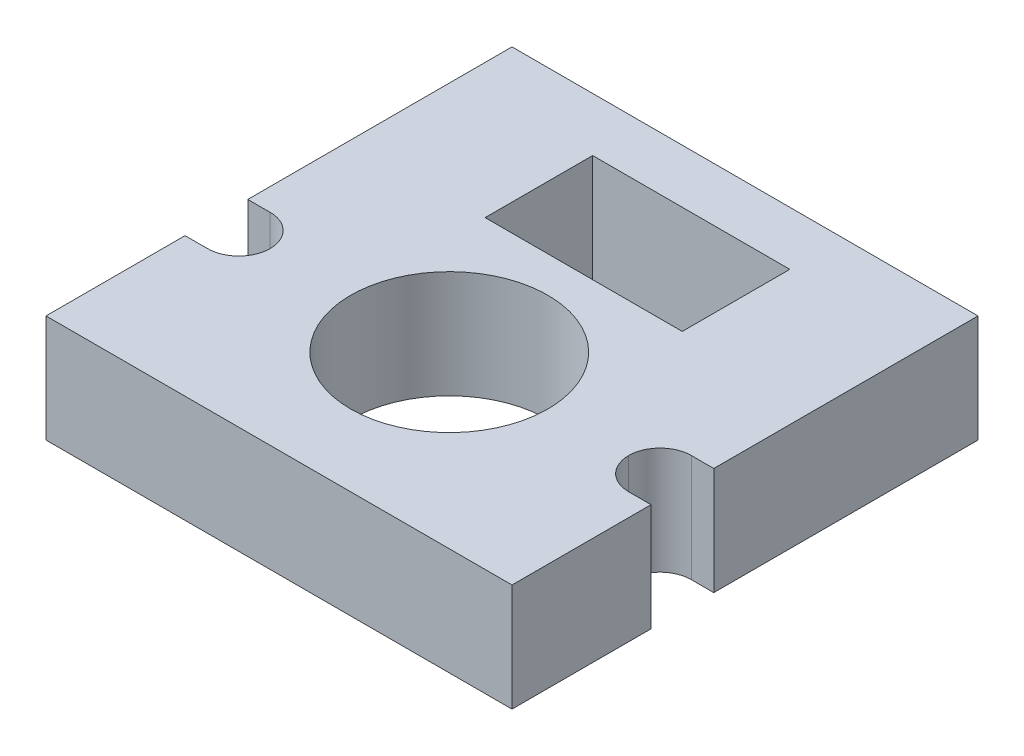
ISO-10303-21;
HEADER;
FILE_DESCRIPTION(('STEP AP214'),'2;1');
FILE_NAME('part.step','',(''),(''),'','','');
FILE_SCHEMA(('AUTOMOTIVE_DESIGN { 1 0 10303 214 1 1 1 1 }'));
ENDSEC;
DATA;
#1=APPLICATION_CONTEXT('core data for automotive mechanical design processes');
#2=APPLICATION_PROTOCOL_DEFINITION('international standard','automotive_design',2000,#1);
#3=PRODUCT_CONTEXT('',#1,'mechanical');
#4=PRODUCT('Part','Part','',(#3));
#5=PRODUCT_RELATED_PRODUCT_CATEGORY('part','',(#4));
#6=PRODUCT_DEFINITION_FORMATION('','',#4);
#7=PRODUCT_DEFINITION_CONTEXT('part definition',#1,'design');
#8=PRODUCT_DEFINITION('design','',#6,#7);
#9=PRODUCT_DEFINITION_SHAPE('','',#8);
#10=(LENGTH_UNIT() NAMED_UNIT(*) SI_UNIT(.MILLI.,.METRE.));
#11=(NAMED_UNIT(*) PLANE_ANGLE_UNIT() SI_UNIT($,.RADIAN.));
#12=(NAMED_UNIT(*) SI_UNIT($,.STERADIAN.) SOLID_ANGLE_UNIT());
#13=UNCERTAINTY_MEASURE_WITH_UNIT(LENGTH_MEASURE(1.E-05),#10,'distance_accuracy_value','');
#14=(GEOMETRIC_REPRESENTATION_CONTEXT(3) GLOBAL_UNCERTAINTY_ASSIGNED_CONTEXT((#13)) GLOBAL_UNIT_ASSIGNED_CONTEXT((#10,
#11,#12)) REPRESENTATION_CONTEXT('',''));
#15=CARTESIAN_POINT('',(0.,0.,0.));
#16=DIRECTION('',(0.,0.,1.));
#17=DIRECTION('',(1.,0.,0.));
#18=AXIS2_PLACEMENT_3D('',#15,#16,#17);
#19=CARTESIAN_POINT('',(-13.,6.,0.));
#20=DIRECTION('',(-1.,0.,0.));
#21=DIRECTION('',(0.,0.,1.));
#22=AXIS2_PLACEMENT_3D('',#19,#20,#21);
#23=PLANE('',#22);
#24=DIRECTION('',(0.,0.,-1.));
#25=VECTOR('',#24,1.);
#26=CARTESIAN_POINT('',(-13.,0.,0.));
#27=LINE('',#26,#25);
#28=CARTESIAN_POINT('',(-13.,0.,1.74228874489923));
#29=VERTEX_POINT('',#28);
#30=CARTESIAN_POINT('',(-13.,0.,-13.));
#31=VERTEX_POINT('',#30);
#32=EDGE_CURVE('E227',#29,#31,#27,.T.);
#33=ORIENTED_EDGE('',*,*,#32,.F.);
#34=DIRECTION('',(0.,-1.,0.));
#35=VECTOR('',#34,1.);
#36=CARTESIAN_POINT('',(-13.,6.,1.74228874489923));
#37=LINE('',#36,#35);
#38=CARTESIAN_POINT('',(-13.,6.,1.74228874489923));
#39=VERTEX_POINT('',#38);
#40=EDGE_CURVE('E268',#39,#29,#37,.T.);
#41=ORIENTED_EDGE('',*,*,#40,.F.);
#42=DIRECTION('',(0.,0.,-1.));
#43=VECTOR('',#42,1.);
#44=CARTESIAN_POINT('',(-13.,6.,0.));
#45=LINE('',#44,#43);
#46=CARTESIAN_POINT('',(-13.,6.,-13.));
#47=VERTEX_POINT('',#46);
#48=EDGE_CURVE('E191',#39,#47,#45,.T.);
#49=ORIENTED_EDGE('',*,*,#48,.T.);
#50=DIRECTION('',(0.,-1.,0.));
#51=VECTOR('',#50,1.);
#52=CARTESIAN_POINT('',(-13.,6.,-13.));
#53=LINE('',#52,#51);
#54=EDGE_CURVE('E171',#47,#31,#53,.T.);
#55=ORIENTED_EDGE('',*,*,#54,.T.);
#56=EDGE_LOOP('',(#33,#41,#49,#55));
#57=FACE_BOUND('',#56,.T.);
#58=ADVANCED_FACE('F34',(#57),#23,.T.);
#59=CARTESIAN_POINT('',(0.,6.,1.74228874489923));
#60=DIRECTION('',(0.,0.,-1.));
#61=DIRECTION('',(-1.,0.,0.));
#62=AXIS2_PLACEMENT_3D('',#59,#60,#61);
#63=PLANE('',#62);
#64=DIRECTION('',(1.,0.,0.));
#65=VECTOR('',#64,1.);
#66=CARTESIAN_POINT('',(0.,0.,1.74228874489923));
#67=LINE('',#66,#65);
#68=CARTESIAN_POINT('',(-11.75,0.,1.74228874489923));
#69=VERTEX_POINT('',#68);
#70=EDGE_CURVE('E230',#29,#69,#67,.T.);
#71=ORIENTED_EDGE('',*,*,#70,.T.);
#72=DIRECTION('',(0.,-1.,0.));
#73=VECTOR('',#72,1.);
#74=CARTESIAN_POINT('',(-11.75,6.,1.74228874489923));
#75=LINE('',#74,#73);
#76=CARTESIAN_POINT('',(-11.75,6.,1.74228874489923));
#77=VERTEX_POINT('',#76);
#78=EDGE_CURVE('E279',#69,#77,#75,.F.);
#79=ORIENTED_EDGE('',*,*,#78,.T.);
#80=DIRECTION('',(1.,0.,0.));
#81=VECTOR('',#80,1.);
#82=CARTESIAN_POINT('',(0.,6.,1.74228874489923));
#83=LINE('',#82,#81);
#84=EDGE_CURVE('E194',#39,#77,#83,.T.);
#85=ORIENTED_EDGE('',*,*,#84,.F.);
#86=ORIENTED_EDGE('',*,*,#40,.T.);
#87=EDGE_LOOP('',(#71,#79,#85,#86));
#88=FACE_BOUND('',#87,.T.);
#89=ADVANCED_FACE('F354',(#88),#63,.F.);
#90=CARTESIAN_POINT('',(0.,6.,5.24228874489923));
#91=DIRECTION('',(0.,0.,1.));
#92=DIRECTION('',(1.,0.,0.));
#93=AXIS2_PLACEMENT_3D('',#90,#91,#92);
#94=PLANE('',#93);
#95=DIRECTION('',(-1.,0.,0.));
#96=VECTOR('',#95,1.);
#97=CARTESIAN_POINT('',(0.,6.,5.24228874489923));
#98=LINE('',#97,#96);
#99=CARTESIAN_POINT('',(-11.75,6.,5.24228874489923));
#100=VERTEX_POINT('',#99);
#101=CARTESIAN_POINT('',(-13.,6.,5.24228874489923));
#102=VERTEX_POINT('',#101);
#103=EDGE_CURVE('E197',#100,#102,#98,.T.);
#104=ORIENTED_EDGE('',*,*,#103,.F.);
#105=DIRECTION('',(0.,-1.,0.));
#106=VECTOR('',#105,1.);
#107=CARTESIAN_POINT('',(-11.75,0.,5.24228874489923));
#108=LINE('',#107,#106);
#109=CARTESIAN_POINT('',(-11.75,0.,5.24228874489923));
#110=VERTEX_POINT('',#109);
#111=EDGE_CURVE('E282',#100,#110,#108,.T.);
#112=ORIENTED_EDGE('',*,*,#111,.T.);
#113=DIRECTION('',(-1.,0.,0.));
#114=VECTOR('',#113,1.);
#115=CARTESIAN_POINT('',(0.,0.,5.24228874489923));
#116=LINE('',#115,#114);
#117=CARTESIAN_POINT('',(-13.,0.,5.24228874489923));
#118=VERTEX_POINT('',#117);
#119=EDGE_CURVE('E234',#110,#118,#116,.T.);
#120=ORIENTED_EDGE('',*,*,#119,.T.);
#121=DIRECTION('',(0.,-1.,0.));
#122=VECTOR('',#121,1.);
#123=CARTESIAN_POINT('',(-13.,6.,5.24228874489923));
#124=LINE('',#123,#122);
#125=EDGE_CURVE('E265',#102,#118,#124,.T.);
#126=ORIENTED_EDGE('',*,*,#125,.F.);
#127=EDGE_LOOP('',(#104,#112,#120,#126));
#128=FACE_BOUND('',#127,.T.);
#129=ADVANCED_FACE('F311',(#128),#94,.F.);
#130=CARTESIAN_POINT('',(-13.,0.,13.));
#131=VERTEX_POINT('',#130);
#132=EDGE_CURVE('E231',#131,#118,#27,.T.);
#133=ORIENTED_EDGE('',*,*,#132,.F.);
#134=DIRECTION('',(0.,-1.,0.));
#135=VECTOR('',#134,1.);
#136=CARTESIAN_POINT('',(-13.,6.,13.));
#137=LINE('',#136,#135);
#138=CARTESIAN_POINT('',(-13.,6.,13.));
#139=VERTEX_POINT('',#138);
#140=EDGE_CURVE('E263',#139,#131,#137,.T.);
#141=ORIENTED_EDGE('',*,*,#140,.F.);
#142=EDGE_CURVE('E195',#139,#102,#45,.T.);
#143=ORIENTED_EDGE('',*,*,#142,.T.);
#144=ORIENTED_EDGE('',*,*,#125,.T.);
#145=EDGE_LOOP('',(#133,#141,#143,#144));
#146=FACE_BOUND('',#145,.T.);
#147=ADVANCED_FACE('F316',(#146),#23,.T.);
#148=CARTESIAN_POINT('',(0.,6.,13.));
#149=DIRECTION('',(0.,0.,1.));
#150=DIRECTION('',(1.,0.,0.));
#151=AXIS2_PLACEMENT_3D('',#148,#149,#150);
#152=PLANE('',#151);
#153=DIRECTION('',(-1.,0.,0.));
#154=VECTOR('',#153,1.);
#155=CARTESIAN_POINT('',(0.,0.,13.));
#156=LINE('',#155,#154);
#157=CARTESIAN_POINT('',(13.,0.,13.));
#158=VERTEX_POINT('',#157);
#159=EDGE_CURVE('E236',#158,#131,#156,.T.);
#160=ORIENTED_EDGE('',*,*,#159,.F.);
#161=DIRECTION('',(0.,-1.,0.));
#162=VECTOR('',#161,1.);
#163=CARTESIAN_POINT('',(13.,6.,13.));
#164=LINE('',#163,#162);
#165=CARTESIAN_POINT('',(13.,6.,13.));
#166=VERTEX_POINT('',#165);
#167=EDGE_CURVE('E261',#166,#158,#164,.T.);
#168=ORIENTED_EDGE('',*,*,#167,.F.);
#169=DIRECTION('',(-1.,0.,0.));
#170=VECTOR('',#169,1.);
#171=CARTESIAN_POINT('',(0.,6.,13.));
#172=LINE('',#171,#170);
#173=EDGE_CURVE('E199',#166,#139,#172,.T.);
#174=ORIENTED_EDGE('',*,*,#173,.T.);
#175=ORIENTED_EDGE('',*,*,#140,.T.);
#176=EDGE_LOOP('',(#160,#168,#174,#175));
#177=FACE_BOUND('',#176,.T.);
#178=ADVANCED_FACE('F320',(#177),#152,.T.);
#179=CARTESIAN_POINT('',(13.,6.,0.));
#180=DIRECTION('',(-1.,0.,0.));
#181=DIRECTION('',(0.,0.,1.));
#182=AXIS2_PLACEMENT_3D('',#179,#180,#181);
#183=PLANE('',#182);
#184=DIRECTION('',(0.,0.,-1.));
#185=VECTOR('',#184,1.);
#186=CARTESIAN_POINT('',(13.,0.,0.));
#187=LINE('',#186,#185);
#188=CARTESIAN_POINT('',(13.,0.,5.24228874489907));
#189=VERTEX_POINT('',#188);
#190=EDGE_CURVE('E239',#158,#189,#187,.T.);
#191=ORIENTED_EDGE('',*,*,#190,.T.);
#192=DIRECTION('',(0.,-1.,0.));
#193=VECTOR('',#192,1.);
#194=CARTESIAN_POINT('',(13.,6.,5.24228874489907));
#195=LINE('',#194,#193);
#196=CARTESIAN_POINT('',(13.,6.,5.24228874489907));
#197=VERTEX_POINT('',#196);
#198=EDGE_CURVE('E258',#197,#189,#195,.T.);
#199=ORIENTED_EDGE('',*,*,#198,.F.);
#200=DIRECTION('',(0.,0.,-1.));
#201=VECTOR('',#200,1.);
#202=CARTESIAN_POINT('',(13.,6.,0.));
#203=LINE('',#202,#201);
#204=EDGE_CURVE('E202',#166,#197,#203,.T.);
#205=ORIENTED_EDGE('',*,*,#204,.F.);
#206=ORIENTED_EDGE('',*,*,#167,.T.);
#207=EDGE_LOOP('',(#191,#199,#205,#206));
#208=FACE_BOUND('',#207,.T.);
#209=ADVANCED_FACE('F325',(#208),#183,.F.);
#210=CARTESIAN_POINT('',(0.,6.,5.24228874489907));
#211=DIRECTION('',(0.,0.,1.));
#212=DIRECTION('',(1.,0.,0.));
#213=AXIS2_PLACEMENT_3D('',#210,#211,#212);
#214=PLANE('',#213);
#215=DIRECTION('',(-1.,0.,0.));
#216=VECTOR('',#215,1.);
#217=CARTESIAN_POINT('',(0.,0.,5.24228874489907));
#218=LINE('',#217,#216);
#219=CARTESIAN_POINT('',(11.75,0.,5.24228874489907));
#220=VERTEX_POINT('',#219);
#221=EDGE_CURVE('E242',#189,#220,#218,.T.);
#222=ORIENTED_EDGE('',*,*,#221,.T.);
#223=DIRECTION('',(0.,-1.,0.));
#224=VECTOR('',#223,1.);
#225=CARTESIAN_POINT('',(11.75,6.,5.24228874489907));
#226=LINE('',#225,#224);
#227=CARTESIAN_POINT('',(11.75,6.,5.24228874489907));
#228=VERTEX_POINT('',#227);
#229=EDGE_CURVE('E277',#220,#228,#226,.F.);
#230=ORIENTED_EDGE('',*,*,#229,.T.);
#231=DIRECTION('',(-1.,0.,0.));
#232=VECTOR('',#231,1.);
#233=CARTESIAN_POINT('',(0.,6.,5.24228874489907));
#234=LINE('',#233,#232);
#235=EDGE_CURVE('E205',#197,#228,#234,.T.);
#236=ORIENTED_EDGE('',*,*,#235,.F.);
#237=ORIENTED_EDGE('',*,*,#198,.T.);
#238=EDGE_LOOP('',(#222,#230,#236,#237));
#239=FACE_BOUND('',#238,.T.);
#240=ADVANCED_FACE('F356',(#239),#214,.F.);
#241=CARTESIAN_POINT('',(0.,6.,1.74228874489907));
#242=DIRECTION('',(0.,0.,-1.));
#243=DIRECTION('',(-1.,0.,0.));
#244=AXIS2_PLACEMENT_3D('',#241,#242,#243);
#245=PLANE('',#244);
#246=DIRECTION('',(1.,0.,0.));
#247=VECTOR('',#246,1.);
#248=CARTESIAN_POINT('',(0.,6.,1.74228874489907));
#249=LINE('',#248,#247);
#250=CARTESIAN_POINT('',(11.75,6.,1.74228874489907));
#251=VERTEX_POINT('',#250);
#252=CARTESIAN_POINT('',(13.,6.,1.74228874489907));
#253=VERTEX_POINT('',#252);
#254=EDGE_CURVE('E209',#251,#253,#249,.T.);
#255=ORIENTED_EDGE('',*,*,#254,.F.);
#256=DIRECTION('',(0.,-1.,0.));
#257=VECTOR('',#256,1.);
#258=CARTESIAN_POINT('',(11.75,0.,1.74228874489907));
#259=LINE('',#258,#257);
#260=CARTESIAN_POINT('',(11.75,0.,1.74228874489907));
#261=VERTEX_POINT('',#260);
#262=EDGE_CURVE('E270',#251,#261,#259,.T.);
#263=ORIENTED_EDGE('',*,*,#262,.T.);
#264=DIRECTION('',(1.,0.,0.));
#265=VECTOR('',#264,1.);
#266=CARTESIAN_POINT('',(0.,0.,1.74228874489907));
#267=LINE('',#266,#265);
#268=CARTESIAN_POINT('',(13.,0.,1.74228874489907));
#269=VERTEX_POINT('',#268);
#270=EDGE_CURVE('E246',#261,#269,#267,.T.);
#271=ORIENTED_EDGE('',*,*,#270,.T.);
#272=DIRECTION('',(0.,-1.,0.));
#273=VECTOR('',#272,1.);
#274=CARTESIAN_POINT('',(13.,6.,1.74228874489907));
#275=LINE('',#274,#273);
#276=EDGE_CURVE('E255',#253,#269,#275,.T.);
#277=ORIENTED_EDGE('',*,*,#276,.F.);
#278=EDGE_LOOP('',(#255,#263,#271,#277));
#279=FACE_BOUND('',#278,.T.);
#280=ADVANCED_FACE('F339',(#279),#245,.F.);
#281=CARTESIAN_POINT('',(13.,0.,-13.));
#282=VERTEX_POINT('',#281);
#283=EDGE_CURVE('E243',#269,#282,#187,.T.);
#284=ORIENTED_EDGE('',*,*,#283,.T.);
#285=DIRECTION('',(0.,-1.,0.));
#286=VECTOR('',#285,1.);
#287=CARTESIAN_POINT('',(13.,6.,-13.));
#288=LINE('',#287,#286);
#289=CARTESIAN_POINT('',(13.,6.,-13.));
#290=VERTEX_POINT('',#289);
#291=EDGE_CURVE('E252',#290,#282,#288,.T.);
#292=ORIENTED_EDGE('',*,*,#291,.F.);
#293=EDGE_CURVE('E206',#253,#290,#203,.T.);
#294=ORIENTED_EDGE('',*,*,#293,.F.);
#295=ORIENTED_EDGE('',*,*,#276,.T.);
#296=EDGE_LOOP('',(#284,#292,#294,#295));
#297=FACE_BOUND('',#296,.T.);
#298=ADVANCED_FACE('F344',(#297),#183,.F.);
#299=CARTESIAN_POINT('',(5.5,6.,0.));
#300=DIRECTION('',(-1.,0.,0.));
#301=DIRECTION('',(0.,0.,1.));
#302=AXIS2_PLACEMENT_3D('',#299,#300,#301);
#303=PLANE('',#302);
#304=DIRECTION('',(0.,0.,-1.));
#305=VECTOR('',#304,1.);
#306=CARTESIAN_POINT('',(5.5,0.,0.));
#307=LINE('',#306,#305);
#308=CARTESIAN_POINT('',(5.5,0.,-4.));
#309=VERTEX_POINT('',#308);
#310=CARTESIAN_POINT('',(5.5,0.,-10.));
#311=VERTEX_POINT('',#310);
#312=EDGE_CURVE('E166',#309,#311,#307,.T.);
#313=ORIENTED_EDGE('',*,*,#312,.F.);
#314=DIRECTION('',(0.,-1.,0.));
#315=VECTOR('',#314,1.);
#316=CARTESIAN_POINT('',(5.5,6.,-4.));
#317=LINE('',#316,#315);
#318=CARTESIAN_POINT('',(5.5,6.,-4.));
#319=VERTEX_POINT('',#318);
#320=EDGE_CURVE('E160',#319,#309,#317,.T.);
#321=ORIENTED_EDGE('',*,*,#320,.F.);
#322=DIRECTION('',(0.,0.,-1.));
#323=VECTOR('',#322,1.);
#324=CARTESIAN_POINT('',(5.5,6.,0.));
#325=LINE('',#324,#323);
#326=CARTESIAN_POINT('',(5.5,6.,-10.));
#327=VERTEX_POINT('',#326);
#328=EDGE_CURVE('E163',#319,#327,#325,.T.);
#329=ORIENTED_EDGE('',*,*,#328,.T.);
#330=DIRECTION('',(0.,-1.,0.));
#331=VECTOR('',#330,1.);
#332=CARTESIAN_POINT('',(5.5,6.,-10.));
#333=LINE('',#332,#331);
#334=EDGE_CURVE('E213',#327,#311,#333,.T.);
#335=ORIENTED_EDGE('',*,*,#334,.T.);
#336=EDGE_LOOP('',(#313,#321,#329,#335));
#337=FACE_BOUND('',#336,.T.);
#338=ADVANCED_FACE('F162',(#337),#303,.T.);
#339=CARTESIAN_POINT('',(0.,6.,-4.));
#340=DIRECTION('',(0.,0.,-1.));
#341=DIRECTION('',(-1.,0.,0.));
#342=AXIS2_PLACEMENT_3D('',#339,#340,#341);
#343=PLANE('',#342);
#344=DIRECTION('',(1.,0.,0.));
#345=VECTOR('',#344,1.);
#346=CARTESIAN_POINT('',(0.,0.,-4.));
#347=LINE('',#346,#345);
#348=CARTESIAN_POINT('',(-5.5,0.,-4.));
#349=VERTEX_POINT('',#348);
#350=EDGE_CURVE('E219',#349,#309,#347,.T.);
#351=ORIENTED_EDGE('',*,*,#350,.F.);
#352=DIRECTION('',(0.,-1.,0.));
#353=VECTOR('',#352,1.);
#354=CARTESIAN_POINT('',(-5.5,6.,-4.));
#355=LINE('',#354,#353);
#356=CARTESIAN_POINT('',(-5.5,6.,-4.));
#357=VERTEX_POINT('',#356);
#358=EDGE_CURVE('E172',#357,#349,#355,.T.);
#359=ORIENTED_EDGE('',*,*,#358,.F.);
#360=DIRECTION('',(1.,0.,0.));
#361=VECTOR('',#360,1.);
#362=CARTESIAN_POINT('',(0.,6.,-4.));
#363=LINE('',#362,#361);
#364=EDGE_CURVE('E178',#357,#319,#363,.T.);
#365=ORIENTED_EDGE('',*,*,#364,.T.);
#366=ORIENTED_EDGE('',*,*,#320,.T.);
#367=EDGE_LOOP('',(#351,#359,#365,#366));
#368=FACE_BOUND('',#367,.T.);
#369=ADVANCED_FACE('F184',(#368),#343,.T.);
#370=CARTESIAN_POINT('',(-5.5,6.,0.));
#371=DIRECTION('',(1.,0.,0.));
#372=DIRECTION('',(0.,0.,-1.));
#373=AXIS2_PLACEMENT_3D('',#370,#371,#372);
#374=PLANE('',#373);
#375=DIRECTION('',(0.,0.,1.));
#376=VECTOR('',#375,1.);
#377=CARTESIAN_POINT('',(-5.5,0.,0.));
#378=LINE('',#377,#376);
#379=CARTESIAN_POINT('',(-5.5,0.,-10.));
#380=VERTEX_POINT('',#379);
#381=EDGE_CURVE('E221',#380,#349,#378,.T.);
#382=ORIENTED_EDGE('',*,*,#381,.F.);
#383=DIRECTION('',(0.,-1.,0.));
#384=VECTOR('',#383,1.);
#385=CARTESIAN_POINT('',(-5.5,6.,-10.));
#386=LINE('',#385,#384);
#387=CARTESIAN_POINT('',(-5.5,6.,-10.));
#388=VERTEX_POINT('',#387);
#389=EDGE_CURVE('E272',#388,#380,#386,.T.);
#390=ORIENTED_EDGE('',*,*,#389,.F.);
#391=DIRECTION('',(0.,0.,1.));
#392=VECTOR('',#391,1.);
#393=CARTESIAN_POINT('',(-5.5,6.,0.));
#394=LINE('',#393,#392);
#395=EDGE_CURVE('E185',#388,#357,#394,.T.);
#396=ORIENTED_EDGE('',*,*,#395,.T.);
#397=ORIENTED_EDGE('',*,*,#358,.T.);
#398=EDGE_LOOP('',(#382,#390,#396,#397));
#399=FACE_BOUND('',#398,.T.);
#400=ADVANCED_FACE('F385',(#399),#374,.T.);
#401=CARTESIAN_POINT('',(0.,6.,-10.));
#402=DIRECTION('',(0.,0.,1.));
#403=DIRECTION('',(1.,0.,0.));
#404=AXIS2_PLACEMENT_3D('',#401,#402,#403);
#405=PLANE('',#404);
#406=DIRECTION('',(-1.,0.,0.));
#407=VECTOR('',#406,1.);
#408=CARTESIAN_POINT('',(0.,0.,-10.));
#409=LINE('',#408,#407);
#410=EDGE_CURVE('E224',#311,#380,#409,.T.);
#411=ORIENTED_EDGE('',*,*,#410,.F.);
#412=ORIENTED_EDGE('',*,*,#334,.F.);
#413=DIRECTION('',(-1.,0.,0.));
#414=VECTOR('',#413,1.);
#415=CARTESIAN_POINT('',(0.,6.,-10.));
#416=LINE('',#415,#414);
#417=EDGE_CURVE('E181',#327,#388,#416,.T.);
#418=ORIENTED_EDGE('',*,*,#417,.T.);
#419=ORIENTED_EDGE('',*,*,#389,.T.);
#420=EDGE_LOOP('',(#411,#412,#418,#419));
#421=FACE_BOUND('',#420,.T.);
#422=ADVANCED_FACE('F381',(#421),#405,.T.);
#423=CARTESIAN_POINT('',(0.,6.,3.5));
#424=DIRECTION('',(0.,-1.,0.));
#425=DIRECTION('',(0.,0.,-1.));
#426=AXIS2_PLACEMENT_3D('',#423,#424,#425);
#427=CYLINDRICAL_SURFACE('',#426,5.5);
#428=CARTESIAN_POINT('',(0.,6.,3.5));
#429=DIRECTION('',(0.,1.,0.));
#430=DIRECTION('',(0.,0.,1.));
#431=AXIS2_PLACEMENT_3D('',#428,#429,#430);
#432=CIRCLE('',#431,5.5);
#433=CARTESIAN_POINT('',(0.,6.,9.));
#434=VERTEX_POINT('',#433);
#435=EDGE_CURVE('E182',#434,#434,#432,.T.);
#436=ORIENTED_EDGE('',*,*,#435,.T.);
#437=EDGE_LOOP('',(#436));
#438=FACE_BOUND('',#437,.T.);
#439=CARTESIAN_POINT('',(0.,0.,3.5));
#440=DIRECTION('',(0.,1.,0.));
#441=DIRECTION('',(0.,0.,1.));
#442=AXIS2_PLACEMENT_3D('',#439,#440,#441);
#443=CIRCLE('',#442,5.5);
#444=CARTESIAN_POINT('',(0.,0.,9.));
#445=VERTEX_POINT('',#444);
#446=EDGE_CURVE('E214',#445,#445,#443,.T.);
#447=ORIENTED_EDGE('',*,*,#446,.F.);
#448=EDGE_LOOP('',(#447));
#449=FACE_BOUND('',#448,.T.);
#450=ADVANCED_FACE('F384',(#438,#449),#427,.F.);
#451=CARTESIAN_POINT('',(0.,6.,-13.));
#452=DIRECTION('',(0.,0.,1.));
#453=DIRECTION('',(1.,0.,0.));
#454=AXIS2_PLACEMENT_3D('',#451,#452,#453);
#455=PLANE('',#454);
#456=DIRECTION('',(-1.,0.,0.));
#457=VECTOR('',#456,1.);
#458=CARTESIAN_POINT('',(0.,0.,-13.));
#459=LINE('',#458,#457);
#460=EDGE_CURVE('E248',#282,#31,#459,.T.);
#461=ORIENTED_EDGE('',*,*,#460,.T.);
#462=ORIENTED_EDGE('',*,*,#54,.F.);
#463=DIRECTION('',(-1.,0.,0.));
#464=VECTOR('',#463,1.);
#465=CARTESIAN_POINT('',(0.,6.,-13.));
#466=LINE('',#465,#464);
#467=EDGE_CURVE('E211',#290,#47,#466,.T.);
#468=ORIENTED_EDGE('',*,*,#467,.F.);
#469=ORIENTED_EDGE('',*,*,#291,.T.);
#470=EDGE_LOOP('',(#461,#462,#468,#469));
#471=FACE_BOUND('',#470,.T.);
#472=ADVANCED_FACE('F348',(#471),#455,.F.);
#473=CARTESIAN_POINT('',(0.,6.,0.));
#474=DIRECTION('',(0.,1.,0.));
#475=DIRECTION('',(0.,0.,1.));
#476=AXIS2_PLACEMENT_3D('',#473,#474,#475);
#477=PLANE('',#476);
#478=ORIENTED_EDGE('',*,*,#435,.F.);
#479=EDGE_LOOP('',(#478));
#480=FACE_BOUND('',#479,.T.);
#481=ORIENTED_EDGE('',*,*,#328,.F.);
#482=ORIENTED_EDGE('',*,*,#364,.F.);
#483=ORIENTED_EDGE('',*,*,#395,.F.);
#484=ORIENTED_EDGE('',*,*,#417,.F.);
#485=EDGE_LOOP('',(#481,#482,#483,#484));
#486=FACE_BOUND('',#485,.T.);
#487=ORIENTED_EDGE('',*,*,#48,.F.);
#488=ORIENTED_EDGE('',*,*,#84,.T.);
#489=CARTESIAN_POINT('',(-11.75,6.,3.49228874489923));
#490=DIRECTION('',(0.,1.,0.));
#491=DIRECTION('',(0.,0.,1.));
#492=AXIS2_PLACEMENT_3D('',#489,#490,#491);
#493=CIRCLE('',#492,1.75);
#494=CARTESIAN_POINT('',(-9.99999999999999,6.,3.49228874489924));
#495=VERTEX_POINT('',#494);
#496=EDGE_CURVE('E50',#77,#495,#493,.F.);
#497=ORIENTED_EDGE('',*,*,#496,.T.);
#498=CARTESIAN_POINT('',(-11.75,6.,3.49228874489923));
#499=DIRECTION('',(0.,1.,0.));
#500=DIRECTION('',(0.,0.,1.));
#501=AXIS2_PLACEMENT_3D('',#498,#499,#500);
#502=CIRCLE('',#501,1.75);
#503=EDGE_CURVE('E11',#495,#100,#502,.F.);
#504=ORIENTED_EDGE('',*,*,#503,.T.);
#505=ORIENTED_EDGE('',*,*,#103,.T.);
#506=ORIENTED_EDGE('',*,*,#142,.F.);
#507=ORIENTED_EDGE('',*,*,#173,.F.);
#508=ORIENTED_EDGE('',*,*,#204,.T.);
#509=ORIENTED_EDGE('',*,*,#235,.T.);
#510=CARTESIAN_POINT('',(11.75,6.,3.49228874489907));
#511=DIRECTION('',(0.,1.,0.));
#512=DIRECTION('',(0.,0.,1.));
#513=AXIS2_PLACEMENT_3D('',#510,#511,#512);
#514=CIRCLE('',#513,1.75);
#515=CARTESIAN_POINT('',(10.,6.,3.49228874489907));
#516=VERTEX_POINT('',#515);
#517=EDGE_CURVE('E290',#228,#516,#514,.F.);
#518=ORIENTED_EDGE('',*,*,#517,.T.);
#519=CARTESIAN_POINT('',(11.75,6.,3.49228874489907));
#520=DIRECTION('',(0.,1.,0.));
#521=DIRECTION('',(0.,0.,1.));
#522=AXIS2_PLACEMENT_3D('',#519,#520,#521);
#523=CIRCLE('',#522,1.75);
#524=EDGE_CURVE('E286',#516,#251,#523,.F.);
#525=ORIENTED_EDGE('',*,*,#524,.T.);
#526=ORIENTED_EDGE('',*,*,#254,.T.);
#527=ORIENTED_EDGE('',*,*,#293,.T.);
#528=ORIENTED_EDGE('',*,*,#467,.T.);
#529=EDGE_LOOP('',(#487,#488,#497,#504,#505,#506,#507,#508,#509,#518,#525,#526,#527,#528));
#530=FACE_BOUND('',#529,.T.);
#531=ADVANCED_FACE('F176',(#480,#486,#530),#477,.T.);
#532=CARTESIAN_POINT('',(0.,0.,0.));
#533=DIRECTION('',(0.,1.,0.));
#534=DIRECTION('',(0.,0.,1.));
#535=AXIS2_PLACEMENT_3D('',#532,#533,#534);
#536=PLANE('',#535);
#537=ORIENTED_EDGE('',*,*,#446,.T.);
#538=EDGE_LOOP('',(#537));
#539=FACE_BOUND('',#538,.T.);
#540=ORIENTED_EDGE('',*,*,#312,.T.);
#541=ORIENTED_EDGE('',*,*,#410,.T.);
#542=ORIENTED_EDGE('',*,*,#381,.T.);
#543=ORIENTED_EDGE('',*,*,#350,.T.);
#544=EDGE_LOOP('',(#540,#541,#542,#543));
#545=FACE_BOUND('',#544,.T.);
#546=ORIENTED_EDGE('',*,*,#32,.T.);
#547=ORIENTED_EDGE('',*,*,#460,.F.);
#548=ORIENTED_EDGE('',*,*,#283,.F.);
#549=ORIENTED_EDGE('',*,*,#270,.F.);
#550=CARTESIAN_POINT('',(11.75,0.,3.49228874489907));
#551=DIRECTION('',(0.,1.,0.));
#552=DIRECTION('',(0.,0.,1.));
#553=AXIS2_PLACEMENT_3D('',#550,#551,#552);
#554=CIRCLE('',#553,1.75);
#555=CARTESIAN_POINT('',(10.,0.,3.49228874489907));
#556=VERTEX_POINT('',#555);
#557=EDGE_CURVE('E284',#261,#556,#554,.T.);
#558=ORIENTED_EDGE('',*,*,#557,.T.);
#559=CARTESIAN_POINT('',(11.75,0.,3.49228874489907));
#560=DIRECTION('',(0.,1.,0.));
#561=DIRECTION('',(0.,0.,1.));
#562=AXIS2_PLACEMENT_3D('',#559,#560,#561);
#563=CIRCLE('',#562,1.75);
#564=EDGE_CURVE('E288',#556,#220,#563,.T.);
#565=ORIENTED_EDGE('',*,*,#564,.T.);
#566=ORIENTED_EDGE('',*,*,#221,.F.);
#567=ORIENTED_EDGE('',*,*,#190,.F.);
#568=ORIENTED_EDGE('',*,*,#159,.T.);
#569=ORIENTED_EDGE('',*,*,#132,.T.);
#570=ORIENTED_EDGE('',*,*,#119,.F.);
#571=CARTESIAN_POINT('',(-11.75,0.,3.49228874489923));
#572=DIRECTION('',(0.,1.,0.));
#573=DIRECTION('',(0.,0.,1.));
#574=AXIS2_PLACEMENT_3D('',#571,#572,#573);
#575=CIRCLE('',#574,1.75);
#576=CARTESIAN_POINT('',(-9.99999999999999,0.,3.49228874489924));
#577=VERTEX_POINT('',#576);
#578=EDGE_CURVE('E43',#110,#577,#575,.T.);
#579=ORIENTED_EDGE('',*,*,#578,.T.);
#580=CARTESIAN_POINT('',(-11.75,0.,3.49228874489923));
#581=DIRECTION('',(0.,1.,0.));
#582=DIRECTION('',(0.,0.,1.));
#583=AXIS2_PLACEMENT_3D('',#580,#581,#582);
#584=CIRCLE('',#583,1.75);
#585=EDGE_CURVE('E292',#577,#69,#584,.T.);
#586=ORIENTED_EDGE('',*,*,#585,.T.);
#587=ORIENTED_EDGE('',*,*,#70,.F.);
#588=EDGE_LOOP('',(#546,#547,#548,#549,#558,#565,#566,#567,#568,#569,#570,#579,#586,#587));
#589=FACE_BOUND('',#588,.T.);
#590=ADVANCED_FACE('F355',(#539,#545,#589),#536,.F.);
#591=CARTESIAN_POINT('',(11.75,6.,3.49228874489907));
#592=DIRECTION('',(0.,1.,0.));
#593=DIRECTION('',(0.,0.,1.));
#594=AXIS2_PLACEMENT_3D('',#591,#592,#593);
#595=CYLINDRICAL_SURFACE('',#594,1.75);
#596=DIRECTION('',(0.,-1.,0.));
#597=VECTOR('',#596,1.);
#598=CARTESIAN_POINT('',(10.,0.,3.49228874489907));
#599=LINE('',#598,#597);
#600=EDGE_CURVE('E217',#516,#556,#599,.T.);
#601=ORIENTED_EDGE('',*,*,#600,.F.);
#602=ORIENTED_EDGE('',*,*,#517,.F.);
#603=ORIENTED_EDGE('',*,*,#229,.F.);
#604=ORIENTED_EDGE('',*,*,#564,.F.);
#605=EDGE_LOOP('',(#601,#602,#603,#604));
#606=FACE_BOUND('',#605,.T.);
#607=ADVANCED_FACE('F330',(#606),#595,.F.);
#608=CARTESIAN_POINT('',(11.75,6.,3.49228874489907));
#609=DIRECTION('',(0.,1.,0.));
#610=DIRECTION('',(0.,0.,1.));
#611=AXIS2_PLACEMENT_3D('',#608,#609,#610);
#612=CYLINDRICAL_SURFACE('',#611,1.75);
#613=ORIENTED_EDGE('',*,*,#524,.F.);
#614=ORIENTED_EDGE('',*,*,#600,.T.);
#615=ORIENTED_EDGE('',*,*,#557,.F.);
#616=ORIENTED_EDGE('',*,*,#262,.F.);
#617=EDGE_LOOP('',(#613,#614,#615,#616));
#618=FACE_BOUND('',#617,.T.);
#619=ADVANCED_FACE('F333',(#618),#612,.F.);
#620=CARTESIAN_POINT('',(-11.75,6.,3.49228874489923));
#621=DIRECTION('',(0.,1.,0.));
#622=DIRECTION('',(0.,0.,1.));
#623=AXIS2_PLACEMENT_3D('',#620,#621,#622);
#624=CYLINDRICAL_SURFACE('',#623,1.75);
#625=ORIENTED_EDGE('',*,*,#111,.F.);
#626=ORIENTED_EDGE('',*,*,#503,.F.);
#627=DIRECTION('',(0.,-1.,0.));
#628=VECTOR('',#627,1.);
#629=CARTESIAN_POINT('',(-9.99999999999999,6.,3.49228874489924));
#630=LINE('',#629,#628);
#631=EDGE_CURVE('E38',#577,#495,#630,.F.);
#632=ORIENTED_EDGE('',*,*,#631,.F.);
#633=ORIENTED_EDGE('',*,*,#578,.F.);
#634=EDGE_LOOP('',(#625,#626,#632,#633));
#635=FACE_BOUND('',#634,.T.);
#636=ADVANCED_FACE('F36',(#635),#624,.F.);
#637=CARTESIAN_POINT('',(-11.75,6.,3.49228874489923));
#638=DIRECTION('',(0.,1.,0.));
#639=DIRECTION('',(0.,0.,1.));
#640=AXIS2_PLACEMENT_3D('',#637,#638,#639);
#641=CYLINDRICAL_SURFACE('',#640,1.75);
#642=ORIENTED_EDGE('',*,*,#496,.F.);
#643=ORIENTED_EDGE('',*,*,#78,.F.);
#644=ORIENTED_EDGE('',*,*,#585,.F.);
#645=ORIENTED_EDGE('',*,*,#631,.T.);
#646=EDGE_LOOP('',(#642,#643,#644,#645));
#647=FACE_BOUND('',#646,.T.);
#648=ADVANCED_FACE('F302',(#647),#641,.F.);
#649=CLOSED_SHELL('',(#58,#89,#129,#147,#178,#209,#240,#280,#298,#338,#369,#400,#422,#450,#472,
#531,#590,#607,#619,#636,#648));
#650=MANIFOLD_SOLID_BREP('B2',#649);
#651=ADVANCED_BREP_SHAPE_REPRESENTATION('',(#18,#650),#14);
#652=SHAPE_DEFINITION_REPRESENTATION(#9,#651);
ENDSEC;
END-ISO-10303-21;
